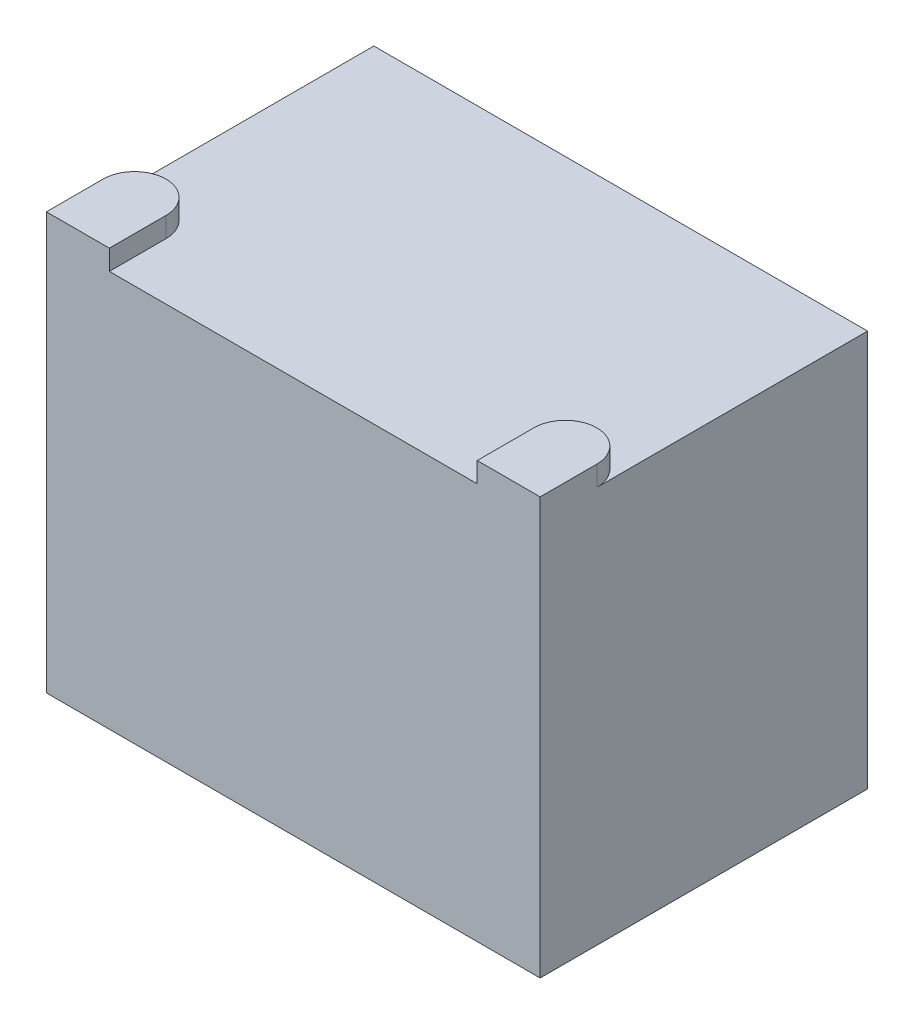
ISO-10303-21;
HEADER;
FILE_DESCRIPTION(('STEP AP214'),'2;1');
FILE_NAME('part.step','',(''),(''),'','','');
FILE_SCHEMA(('AUTOMOTIVE_DESIGN { 1 0 10303 214 1 1 1 1 }'));
ENDSEC;
DATA;
#1=APPLICATION_CONTEXT('core data for automotive mechanical design processes');
#2=APPLICATION_PROTOCOL_DEFINITION('international standard','automotive_design',2000,#1);
#3=PRODUCT_CONTEXT('',#1,'mechanical');
#4=PRODUCT('Part','Part','',(#3));
#5=PRODUCT_RELATED_PRODUCT_CATEGORY('part','',(#4));
#6=PRODUCT_DEFINITION_FORMATION('','',#4);
#7=PRODUCT_DEFINITION_CONTEXT('part definition',#1,'design');
#8=PRODUCT_DEFINITION('design','',#6,#7);
#9=PRODUCT_DEFINITION_SHAPE('','',#8);
#10=(LENGTH_UNIT() NAMED_UNIT(*) SI_UNIT(.MILLI.,.METRE.));
#11=(NAMED_UNIT(*) PLANE_ANGLE_UNIT() SI_UNIT($,.RADIAN.));
#12=(NAMED_UNIT(*) SI_UNIT($,.STERADIAN.) SOLID_ANGLE_UNIT());
#13=UNCERTAINTY_MEASURE_WITH_UNIT(LENGTH_MEASURE(1.E-05),#10,'distance_accuracy_value','');
#14=(GEOMETRIC_REPRESENTATION_CONTEXT(3) GLOBAL_UNCERTAINTY_ASSIGNED_CONTEXT((#13)) GLOBAL_UNIT_ASSIGNED_CONTEXT((#10,
#11,#12)) REPRESENTATION_CONTEXT('',''));
#15=CARTESIAN_POINT('',(0.,0.,0.));
#16=DIRECTION('',(0.,0.,1.));
#17=DIRECTION('',(1.,0.,0.));
#18=AXIS2_PLACEMENT_3D('',#15,#16,#17);
#19=CARTESIAN_POINT('',(0.,157.48,0.));
#20=DIRECTION('',(0.,1.,0.));
#21=DIRECTION('',(0.,0.,1.));
#22=AXIS2_PLACEMENT_3D('',#19,#20,#21);
#23=PLANE('',#22);
#24=CARTESIAN_POINT('',(85.544,157.48,42.524));
#25=DIRECTION('',(0.,1.,0.));
#26=DIRECTION('',(0.,0.,1.));
#27=AXIS2_PLACEMENT_3D('',#24,#25,#26);
#28=CIRCLE('',#27,12.5);
#29=CARTESIAN_POINT('',(73.044,157.48,42.524));
#30=VERTEX_POINT('',#29);
#31=CARTESIAN_POINT('',(85.544,157.48,30.024));
#32=VERTEX_POINT('',#31);
#33=EDGE_CURVE('E62',#30,#32,#28,.F.);
#34=ORIENTED_EDGE('',*,*,#33,.T.);
#35=CARTESIAN_POINT('',(85.544,157.48,42.524));
#36=DIRECTION('',(0.,1.,0.));
#37=DIRECTION('',(0.,0.,1.));
#38=AXIS2_PLACEMENT_3D('',#35,#36,#37);
#39=CIRCLE('',#38,12.5);
#40=CARTESIAN_POINT('',(98.044,157.48,42.524));
#41=VERTEX_POINT('',#40);
#42=EDGE_CURVE('E216',#32,#41,#39,.F.);
#43=ORIENTED_EDGE('',*,*,#42,.T.);
#44=DIRECTION('',(0.,0.,-1.));
#45=VECTOR('',#44,1.);
#46=CARTESIAN_POINT('',(98.044,157.48,-65.024));
#47=LINE('',#46,#45);
#48=CARTESIAN_POINT('',(98.044,157.48,-65.024));
#49=VERTEX_POINT('',#48);
#50=EDGE_CURVE('E173',#41,#49,#47,.T.);
#51=ORIENTED_EDGE('',*,*,#50,.T.);
#52=DIRECTION('',(-1.,0.,0.));
#53=VECTOR('',#52,1.);
#54=CARTESIAN_POINT('',(-98.044,157.48,-65.024));
#55=LINE('',#54,#53);
#56=CARTESIAN_POINT('',(-98.044,157.48,-65.024));
#57=VERTEX_POINT('',#56);
#58=EDGE_CURVE('E175',#49,#57,#55,.T.);
#59=ORIENTED_EDGE('',*,*,#58,.T.);
#60=DIRECTION('',(0.,0.,1.));
#61=VECTOR('',#60,1.);
#62=CARTESIAN_POINT('',(-98.044,157.48,-65.024));
#63=LINE('',#62,#61);
#64=CARTESIAN_POINT('',(-98.044,157.48,42.524));
#65=VERTEX_POINT('',#64);
#66=EDGE_CURVE('E178',#57,#65,#63,.T.);
#67=ORIENTED_EDGE('',*,*,#66,.T.);
#68=CARTESIAN_POINT('',(-85.544,157.48,42.524));
#69=DIRECTION('',(0.,1.,0.));
#70=DIRECTION('',(0.,0.,1.));
#71=AXIS2_PLACEMENT_3D('',#68,#69,#70);
#72=CIRCLE('',#71,12.5);
#73=CARTESIAN_POINT('',(-85.544,157.48,30.024));
#74=VERTEX_POINT('',#73);
#75=EDGE_CURVE('E49',#65,#74,#72,.F.);
#76=ORIENTED_EDGE('',*,*,#75,.T.);
#77=CARTESIAN_POINT('',(-85.544,157.48,42.524));
#78=DIRECTION('',(0.,1.,0.));
#79=DIRECTION('',(0.,0.,1.));
#80=AXIS2_PLACEMENT_3D('',#77,#78,#79);
#81=CIRCLE('',#80,12.5);
#82=CARTESIAN_POINT('',(-73.044,157.48,42.524));
#83=VERTEX_POINT('',#82);
#84=EDGE_CURVE('E11',#74,#83,#81,.F.);
#85=ORIENTED_EDGE('',*,*,#84,.T.);
#86=DIRECTION('',(0.,0.,-1.));
#87=VECTOR('',#86,1.);
#88=CARTESIAN_POINT('',(-73.044,157.48,65.024));
#89=LINE('',#88,#87);
#90=CARTESIAN_POINT('',(-73.044,157.48,65.024));
#91=VERTEX_POINT('',#90);
#92=EDGE_CURVE('E150',#91,#83,#89,.T.);
#93=ORIENTED_EDGE('',*,*,#92,.F.);
#94=DIRECTION('',(1.,0.,0.));
#95=VECTOR('',#94,1.);
#96=CARTESIAN_POINT('',(-98.044,157.48,65.024));
#97=LINE('',#96,#95);
#98=CARTESIAN_POINT('',(73.044,157.48,65.024));
#99=VERTEX_POINT('',#98);
#100=EDGE_CURVE('E180',#91,#99,#97,.T.);
#101=ORIENTED_EDGE('',*,*,#100,.T.);
#102=DIRECTION('',(0.,0.,1.));
#103=VECTOR('',#102,1.);
#104=CARTESIAN_POINT('',(73.044,157.48,65.024));
#105=LINE('',#104,#103);
#106=EDGE_CURVE('E146',#30,#99,#105,.T.);
#107=ORIENTED_EDGE('',*,*,#106,.F.);
#108=EDGE_LOOP('',(#34,#43,#51,#59,#67,#76,#85,#93,#101,#107));
#109=FACE_BOUND('',#108,.T.);
#110=ADVANCED_FACE('F40',(#109),#23,.T.);
#111=CARTESIAN_POINT('',(98.044,157.48,-65.024));
#112=DIRECTION('',(-1.,0.,0.));
#113=DIRECTION('',(0.,0.,1.));
#114=AXIS2_PLACEMENT_3D('',#111,#112,#113);
#115=PLANE('',#114);
#116=ORIENTED_EDGE('',*,*,#50,.F.);
#117=DIRECTION('',(0.,-1.,0.));
#118=VECTOR('',#117,1.);
#119=CARTESIAN_POINT('',(98.044,157.48,42.524));
#120=LINE('',#119,#118);
#121=CARTESIAN_POINT('',(98.044,165.48,42.524));
#122=VERTEX_POINT('',#121);
#123=EDGE_CURVE('E204',#41,#122,#120,.F.);
#124=ORIENTED_EDGE('',*,*,#123,.T.);
#125=DIRECTION('',(0.,0.,-1.));
#126=VECTOR('',#125,1.);
#127=CARTESIAN_POINT('',(98.044,165.48,65.024));
#128=LINE('',#127,#126);
#129=CARTESIAN_POINT('',(98.044,165.48,65.024));
#130=VERTEX_POINT('',#129);
#131=EDGE_CURVE('E141',#130,#122,#128,.T.);
#132=ORIENTED_EDGE('',*,*,#131,.F.);
#133=DIRECTION('',(0.,-1.,0.));
#134=VECTOR('',#133,1.);
#135=CARTESIAN_POINT('',(98.044,157.48,65.024));
#136=LINE('',#135,#134);
#137=CARTESIAN_POINT('',(98.044,0.,65.024));
#138=VERTEX_POINT('',#137);
#139=EDGE_CURVE('E154',#130,#138,#136,.T.);
#140=ORIENTED_EDGE('',*,*,#139,.T.);
#141=DIRECTION('',(0.,0.,-1.));
#142=VECTOR('',#141,1.);
#143=CARTESIAN_POINT('',(98.044,0.,-65.024));
#144=LINE('',#143,#142);
#145=CARTESIAN_POINT('',(98.044,0.,-65.024));
#146=VERTEX_POINT('',#145);
#147=EDGE_CURVE('E172',#138,#146,#144,.T.);
#148=ORIENTED_EDGE('',*,*,#147,.T.);
#149=DIRECTION('',(0.,-1.,0.));
#150=VECTOR('',#149,1.);
#151=CARTESIAN_POINT('',(98.044,157.48,-65.024));
#152=LINE('',#151,#150);
#153=EDGE_CURVE('E196',#49,#146,#152,.T.);
#154=ORIENTED_EDGE('',*,*,#153,.F.);
#155=EDGE_LOOP('',(#116,#124,#132,#140,#148,#154));
#156=FACE_BOUND('',#155,.T.);
#157=ADVANCED_FACE('F249',(#156),#115,.F.);
#158=CARTESIAN_POINT('',(-98.044,157.48,-65.024));
#159=DIRECTION('',(0.,0.,1.));
#160=DIRECTION('',(1.,0.,0.));
#161=AXIS2_PLACEMENT_3D('',#158,#159,#160);
#162=PLANE('',#161);
#163=DIRECTION('',(-1.,0.,0.));
#164=VECTOR('',#163,1.);
#165=CARTESIAN_POINT('',(-98.044,0.,-65.024));
#166=LINE('',#165,#164);
#167=CARTESIAN_POINT('',(-98.044,0.,-65.024));
#168=VERTEX_POINT('',#167);
#169=EDGE_CURVE('E184',#146,#168,#166,.T.);
#170=ORIENTED_EDGE('',*,*,#169,.T.);
#171=DIRECTION('',(0.,-1.,0.));
#172=VECTOR('',#171,1.);
#173=CARTESIAN_POINT('',(-98.044,157.48,-65.024));
#174=LINE('',#173,#172);
#175=EDGE_CURVE('E193',#57,#168,#174,.T.);
#176=ORIENTED_EDGE('',*,*,#175,.F.);
#177=ORIENTED_EDGE('',*,*,#58,.F.);
#178=ORIENTED_EDGE('',*,*,#153,.T.);
#179=EDGE_LOOP('',(#170,#176,#177,#178));
#180=FACE_BOUND('',#179,.T.);
#181=ADVANCED_FACE('F269',(#180),#162,.F.);
#182=CARTESIAN_POINT('',(-98.044,157.48,-65.024));
#183=DIRECTION('',(1.,0.,0.));
#184=DIRECTION('',(0.,0.,-1.));
#185=AXIS2_PLACEMENT_3D('',#182,#183,#184);
#186=PLANE('',#185);
#187=DIRECTION('',(0.,0.,1.));
#188=VECTOR('',#187,1.);
#189=CARTESIAN_POINT('',(-98.044,165.48,65.024));
#190=LINE('',#189,#188);
#191=CARTESIAN_POINT('',(-98.044,165.48,42.524));
#192=VERTEX_POINT('',#191);
#193=CARTESIAN_POINT('',(-98.044,165.48,65.024));
#194=VERTEX_POINT('',#193);
#195=EDGE_CURVE('E160',#192,#194,#190,.T.);
#196=ORIENTED_EDGE('',*,*,#195,.F.);
#197=DIRECTION('',(0.,-1.,0.));
#198=VECTOR('',#197,1.);
#199=CARTESIAN_POINT('',(-98.044,157.48,42.524));
#200=LINE('',#199,#198);
#201=EDGE_CURVE('E206',#192,#65,#200,.T.);
#202=ORIENTED_EDGE('',*,*,#201,.T.);
#203=ORIENTED_EDGE('',*,*,#66,.F.);
#204=ORIENTED_EDGE('',*,*,#175,.T.);
#205=DIRECTION('',(0.,0.,1.));
#206=VECTOR('',#205,1.);
#207=CARTESIAN_POINT('',(-98.044,0.,-65.024));
#208=LINE('',#207,#206);
#209=CARTESIAN_POINT('',(-98.044,0.,65.024));
#210=VERTEX_POINT('',#209);
#211=EDGE_CURVE('E186',#168,#210,#208,.T.);
#212=ORIENTED_EDGE('',*,*,#211,.T.);
#213=DIRECTION('',(0.,-1.,0.));
#214=VECTOR('',#213,1.);
#215=CARTESIAN_POINT('',(-98.044,157.48,65.024));
#216=LINE('',#215,#214);
#217=EDGE_CURVE('E190',#194,#210,#216,.T.);
#218=ORIENTED_EDGE('',*,*,#217,.F.);
#219=EDGE_LOOP('',(#196,#202,#203,#204,#212,#218));
#220=FACE_BOUND('',#219,.T.);
#221=ADVANCED_FACE('F241',(#220),#186,.F.);
#222=CARTESIAN_POINT('',(-98.044,157.48,65.024));
#223=DIRECTION('',(0.,0.,-1.));
#224=DIRECTION('',(-1.,0.,0.));
#225=AXIS2_PLACEMENT_3D('',#222,#223,#224);
#226=PLANE('',#225);
#227=DIRECTION('',(1.,0.,0.));
#228=VECTOR('',#227,1.);
#229=CARTESIAN_POINT('',(-98.044,0.,65.024));
#230=LINE('',#229,#228);
#231=EDGE_CURVE('E176',#210,#138,#230,.T.);
#232=ORIENTED_EDGE('',*,*,#231,.T.);
#233=ORIENTED_EDGE('',*,*,#139,.F.);
#234=DIRECTION('',(1.,0.,0.));
#235=VECTOR('',#234,1.);
#236=CARTESIAN_POINT('',(98.044,165.48,65.024));
#237=LINE('',#236,#235);
#238=CARTESIAN_POINT('',(73.044,165.48,65.024));
#239=VERTEX_POINT('',#238);
#240=EDGE_CURVE('E134',#239,#130,#237,.T.);
#241=ORIENTED_EDGE('',*,*,#240,.F.);
#242=DIRECTION('',(0.,-1.,0.));
#243=VECTOR('',#242,1.);
#244=CARTESIAN_POINT('',(73.044,165.48,65.024));
#245=LINE('',#244,#243);
#246=EDGE_CURVE('E144',#239,#99,#245,.T.);
#247=ORIENTED_EDGE('',*,*,#246,.T.);
#248=ORIENTED_EDGE('',*,*,#100,.F.);
#249=DIRECTION('',(0.,-1.,0.));
#250=VECTOR('',#249,1.);
#251=CARTESIAN_POINT('',(-73.044,165.48,65.024));
#252=LINE('',#251,#250);
#253=CARTESIAN_POINT('',(-73.044,165.48,65.024));
#254=VERTEX_POINT('',#253);
#255=EDGE_CURVE('E167',#254,#91,#252,.T.);
#256=ORIENTED_EDGE('',*,*,#255,.F.);
#257=DIRECTION('',(1.,0.,0.));
#258=VECTOR('',#257,1.);
#259=CARTESIAN_POINT('',(-98.044,165.48,65.024));
#260=LINE('',#259,#258);
#261=EDGE_CURVE('E162',#194,#254,#260,.T.);
#262=ORIENTED_EDGE('',*,*,#261,.F.);
#263=ORIENTED_EDGE('',*,*,#217,.T.);
#264=EDGE_LOOP('',(#232,#233,#241,#247,#248,#256,#262,#263));
#265=FACE_BOUND('',#264,.T.);
#266=ADVANCED_FACE('F152',(#265),#226,.F.);
#267=CARTESIAN_POINT('',(0.,0.,0.));
#268=DIRECTION('',(0.,1.,0.));
#269=DIRECTION('',(0.,0.,1.));
#270=AXIS2_PLACEMENT_3D('',#267,#268,#269);
#271=PLANE('',#270);
#272=ORIENTED_EDGE('',*,*,#147,.F.);
#273=ORIENTED_EDGE('',*,*,#231,.F.);
#274=ORIENTED_EDGE('',*,*,#211,.F.);
#275=ORIENTED_EDGE('',*,*,#169,.F.);
#276=EDGE_LOOP('',(#272,#273,#274,#275));
#277=FACE_BOUND('',#276,.T.);
#278=ADVANCED_FACE('F247',(#277),#271,.F.);
#279=CARTESIAN_POINT('',(-73.044,165.48,65.024));
#280=DIRECTION('',(-1.,0.,0.));
#281=DIRECTION('',(0.,0.,1.));
#282=AXIS2_PLACEMENT_3D('',#279,#280,#281);
#283=PLANE('',#282);
#284=ORIENTED_EDGE('',*,*,#92,.T.);
#285=DIRECTION('',(0.,-1.,0.));
#286=VECTOR('',#285,1.);
#287=CARTESIAN_POINT('',(-73.044,165.48,42.524));
#288=LINE('',#287,#286);
#289=CARTESIAN_POINT('',(-73.044,165.48,42.524));
#290=VERTEX_POINT('',#289);
#291=EDGE_CURVE('E213',#83,#290,#288,.F.);
#292=ORIENTED_EDGE('',*,*,#291,.T.);
#293=DIRECTION('',(0.,0.,-1.));
#294=VECTOR('',#293,1.);
#295=CARTESIAN_POINT('',(-73.044,165.48,65.024));
#296=LINE('',#295,#294);
#297=EDGE_CURVE('E164',#254,#290,#296,.T.);
#298=ORIENTED_EDGE('',*,*,#297,.F.);
#299=ORIENTED_EDGE('',*,*,#255,.T.);
#300=EDGE_LOOP('',(#284,#292,#298,#299));
#301=FACE_BOUND('',#300,.T.);
#302=ADVANCED_FACE('F231',(#301),#283,.F.);
#303=CARTESIAN_POINT('',(0.,165.48,0.));
#304=DIRECTION('',(0.,-1.,0.));
#305=DIRECTION('',(0.,0.,-1.));
#306=AXIS2_PLACEMENT_3D('',#303,#304,#305);
#307=PLANE('',#306);
#308=CARTESIAN_POINT('',(-85.544,165.48,42.524));
#309=DIRECTION('',(0.,-1.,0.));
#310=DIRECTION('',(0.,0.,-1.));
#311=AXIS2_PLACEMENT_3D('',#308,#309,#310);
#312=CIRCLE('',#311,12.5);
#313=CARTESIAN_POINT('',(-85.544,165.48,30.024));
#314=VERTEX_POINT('',#313);
#315=EDGE_CURVE('E209',#290,#314,#312,.F.);
#316=ORIENTED_EDGE('',*,*,#315,.T.);
#317=CARTESIAN_POINT('',(-85.544,165.48,42.524));
#318=DIRECTION('',(0.,-1.,0.));
#319=DIRECTION('',(0.,0.,-1.));
#320=AXIS2_PLACEMENT_3D('',#317,#318,#319);
#321=CIRCLE('',#320,12.5);
#322=EDGE_CURVE('E211',#314,#192,#321,.F.);
#323=ORIENTED_EDGE('',*,*,#322,.T.);
#324=ORIENTED_EDGE('',*,*,#195,.T.);
#325=ORIENTED_EDGE('',*,*,#261,.T.);
#326=ORIENTED_EDGE('',*,*,#297,.T.);
#327=EDGE_LOOP('',(#316,#323,#324,#325,#326));
#328=FACE_BOUND('',#327,.T.);
#329=ADVANCED_FACE('F238',(#328),#307,.F.);
#330=CARTESIAN_POINT('',(73.044,165.48,65.024));
#331=DIRECTION('',(1.,0.,0.));
#332=DIRECTION('',(0.,0.,-1.));
#333=AXIS2_PLACEMENT_3D('',#330,#331,#332);
#334=PLANE('',#333);
#335=DIRECTION('',(0.,0.,1.));
#336=VECTOR('',#335,1.);
#337=CARTESIAN_POINT('',(73.044,165.48,65.024));
#338=LINE('',#337,#336);
#339=CARTESIAN_POINT('',(73.044,165.48,42.524));
#340=VERTEX_POINT('',#339);
#341=EDGE_CURVE('E129',#340,#239,#338,.T.);
#342=ORIENTED_EDGE('',*,*,#341,.F.);
#343=DIRECTION('',(0.,-1.,0.));
#344=VECTOR('',#343,1.);
#345=CARTESIAN_POINT('',(73.044,165.48,42.524));
#346=LINE('',#345,#344);
#347=EDGE_CURVE('E199',#340,#30,#346,.T.);
#348=ORIENTED_EDGE('',*,*,#347,.T.);
#349=ORIENTED_EDGE('',*,*,#106,.T.);
#350=ORIENTED_EDGE('',*,*,#246,.F.);
#351=EDGE_LOOP('',(#342,#348,#349,#350));
#352=FACE_BOUND('',#351,.T.);
#353=ADVANCED_FACE('F145',(#352),#334,.F.);
#354=CARTESIAN_POINT('',(0.,165.48,0.));
#355=DIRECTION('',(0.,1.,0.));
#356=DIRECTION('',(0.,0.,1.));
#357=AXIS2_PLACEMENT_3D('',#354,#355,#356);
#358=PLANE('',#357);
#359=CARTESIAN_POINT('',(85.544,165.48,42.524));
#360=DIRECTION('',(0.,1.,0.));
#361=DIRECTION('',(0.,0.,1.));
#362=AXIS2_PLACEMENT_3D('',#359,#360,#361);
#363=CIRCLE('',#362,12.5);
#364=CARTESIAN_POINT('',(85.544,165.48,30.024));
#365=VERTEX_POINT('',#364);
#366=EDGE_CURVE('E201',#122,#365,#363,.T.);
#367=ORIENTED_EDGE('',*,*,#366,.T.);
#368=CARTESIAN_POINT('',(85.544,165.48,42.524));
#369=DIRECTION('',(0.,1.,0.));
#370=DIRECTION('',(0.,0.,1.));
#371=AXIS2_PLACEMENT_3D('',#368,#369,#370);
#372=CIRCLE('',#371,12.5);
#373=EDGE_CURVE('E137',#365,#340,#372,.T.);
#374=ORIENTED_EDGE('',*,*,#373,.T.);
#375=ORIENTED_EDGE('',*,*,#341,.T.);
#376=ORIENTED_EDGE('',*,*,#240,.T.);
#377=ORIENTED_EDGE('',*,*,#131,.T.);
#378=EDGE_LOOP('',(#367,#374,#375,#376,#377));
#379=FACE_BOUND('',#378,.T.);
#380=ADVANCED_FACE('F131',(#379),#358,.T.);
#381=CARTESIAN_POINT('',(85.544,165.48,42.524));
#382=DIRECTION('',(0.,-1.,0.));
#383=DIRECTION('',(0.,0.,-1.));
#384=AXIS2_PLACEMENT_3D('',#381,#382,#383);
#385=CYLINDRICAL_SURFACE('',#384,12.5);
#386=DIRECTION('',(0.,-1.,0.));
#387=VECTOR('',#386,1.);
#388=CARTESIAN_POINT('',(85.544,165.48,30.024));
#389=LINE('',#388,#387);
#390=EDGE_CURVE('E158',#365,#32,#389,.T.);
#391=ORIENTED_EDGE('',*,*,#390,.F.);
#392=ORIENTED_EDGE('',*,*,#366,.F.);
#393=ORIENTED_EDGE('',*,*,#123,.F.);
#394=ORIENTED_EDGE('',*,*,#42,.F.);
#395=EDGE_LOOP('',(#391,#392,#393,#394));
#396=FACE_BOUND('',#395,.T.);
#397=ADVANCED_FACE('F254',(#396),#385,.T.);
#398=CARTESIAN_POINT('',(85.544,165.48,42.524));
#399=DIRECTION('',(0.,-1.,0.));
#400=DIRECTION('',(0.,0.,-1.));
#401=AXIS2_PLACEMENT_3D('',#398,#399,#400);
#402=CYLINDRICAL_SURFACE('',#401,12.5);
#403=ORIENTED_EDGE('',*,*,#373,.F.);
#404=ORIENTED_EDGE('',*,*,#390,.T.);
#405=ORIENTED_EDGE('',*,*,#33,.F.);
#406=ORIENTED_EDGE('',*,*,#347,.F.);
#407=EDGE_LOOP('',(#403,#404,#405,#406));
#408=FACE_BOUND('',#407,.T.);
#409=ADVANCED_FACE('F255',(#408),#402,.T.);
#410=CARTESIAN_POINT('',(-85.544,165.48,42.524));
#411=DIRECTION('',(0.,-1.,0.));
#412=DIRECTION('',(0.,0.,-1.));
#413=AXIS2_PLACEMENT_3D('',#410,#411,#412);
#414=CYLINDRICAL_SURFACE('',#413,12.5);
#415=DIRECTION('',(0.,-1.,0.));
#416=VECTOR('',#415,1.);
#417=CARTESIAN_POINT('',(-85.544,165.48,30.024));
#418=LINE('',#417,#416);
#419=EDGE_CURVE('E44',#314,#74,#418,.T.);
#420=ORIENTED_EDGE('',*,*,#419,.F.);
#421=ORIENTED_EDGE('',*,*,#315,.F.);
#422=ORIENTED_EDGE('',*,*,#291,.F.);
#423=ORIENTED_EDGE('',*,*,#84,.F.);
#424=EDGE_LOOP('',(#420,#421,#422,#423));
#425=FACE_BOUND('',#424,.T.);
#426=ADVANCED_FACE('F42',(#425),#414,.T.);
#427=CARTESIAN_POINT('',(-85.544,157.48,42.524));
#428=DIRECTION('',(0.,-1.,0.));
#429=DIRECTION('',(0.,0.,-1.));
#430=AXIS2_PLACEMENT_3D('',#427,#428,#429);
#431=CYLINDRICAL_SURFACE('',#430,12.5);
#432=ORIENTED_EDGE('',*,*,#322,.F.);
#433=ORIENTED_EDGE('',*,*,#419,.T.);
#434=ORIENTED_EDGE('',*,*,#75,.F.);
#435=ORIENTED_EDGE('',*,*,#201,.F.);
#436=EDGE_LOOP('',(#432,#433,#434,#435));
#437=FACE_BOUND('',#436,.T.);
#438=ADVANCED_FACE('F225',(#437),#431,.T.);
#439=CLOSED_SHELL('',(#110,#157,#181,#221,#266,#278,#302,#329,#353,#380,#397,#409,#426,#438));
#440=MANIFOLD_SOLID_BREP('B2',#439);
#441=ADVANCED_BREP_SHAPE_REPRESENTATION('',(#18,#440),#14);
#442=SHAPE_DEFINITION_REPRESENTATION(#9,#441);
ENDSEC;
END-ISO-10303-21;
